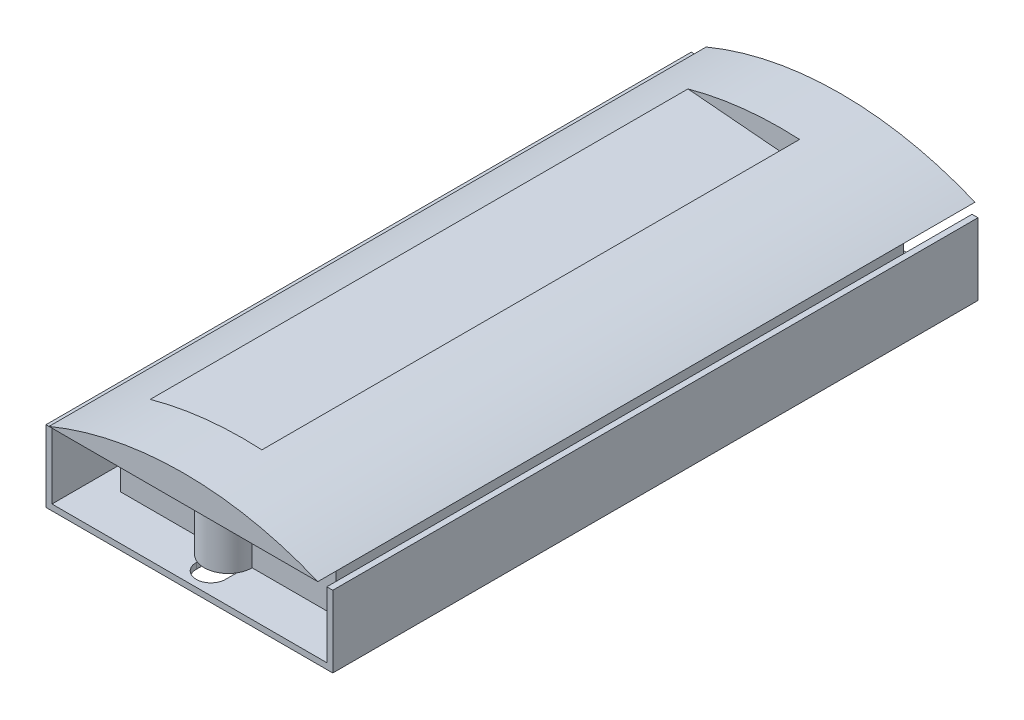
ISO-10303-21;
HEADER;
FILE_DESCRIPTION(('STEP AP214'),'2;1');
FILE_NAME('part.step','',(''),(''),'','','');
FILE_SCHEMA(('AUTOMOTIVE_DESIGN { 1 0 10303 214 1 1 1 1 }'));
ENDSEC;
DATA;
#1=APPLICATION_CONTEXT('core data for automotive mechanical design processes');
#2=APPLICATION_PROTOCOL_DEFINITION('international standard','automotive_design',2000,#1);
#3=PRODUCT_CONTEXT('',#1,'mechanical');
#4=PRODUCT('Part','Part','',(#3));
#5=PRODUCT_RELATED_PRODUCT_CATEGORY('part','',(#4));
#6=PRODUCT_DEFINITION_FORMATION('','',#4);
#7=PRODUCT_DEFINITION_CONTEXT('part definition',#1,'design');
#8=PRODUCT_DEFINITION('design','',#6,#7);
#9=PRODUCT_DEFINITION_SHAPE('','',#8);
#10=(LENGTH_UNIT() NAMED_UNIT(*) SI_UNIT(.MILLI.,.METRE.));
#11=(NAMED_UNIT(*) PLANE_ANGLE_UNIT() SI_UNIT($,.RADIAN.));
#12=(NAMED_UNIT(*) SI_UNIT($,.STERADIAN.) SOLID_ANGLE_UNIT());
#13=UNCERTAINTY_MEASURE_WITH_UNIT(LENGTH_MEASURE(1.E-05),#10,'distance_accuracy_value','');
#14=(GEOMETRIC_REPRESENTATION_CONTEXT(3) GLOBAL_UNCERTAINTY_ASSIGNED_CONTEXT((#13)) GLOBAL_UNIT_ASSIGNED_CONTEXT((#10,
#11,#12)) REPRESENTATION_CONTEXT('',''));
#15=CARTESIAN_POINT('',(0.,0.,0.));
#16=DIRECTION('',(0.,0.,1.));
#17=DIRECTION('',(1.,0.,0.));
#18=AXIS2_PLACEMENT_3D('',#15,#16,#17);
#19=CARTESIAN_POINT('',(0.,-13.,0.));
#20=DIRECTION('',(0.,1.,0.));
#21=DIRECTION('',(0.,0.,1.));
#22=AXIS2_PLACEMENT_3D('',#19,#20,#21);
#23=PLANE('',#22);
#24=CARTESIAN_POINT('',(22.5,-13.,4.6));
#25=DIRECTION('',(0.,-1.,0.));
#26=DIRECTION('',(0.,0.,-1.));
#27=AXIS2_PLACEMENT_3D('',#24,#25,#26);
#28=CIRCLE('',#27,2.45);
#29=CARTESIAN_POINT('',(20.05,-13.,4.6));
#30=VERTEX_POINT('',#29);
#31=CARTESIAN_POINT('',(24.95,-13.,4.60000000000001));
#32=VERTEX_POINT('',#31);
#33=EDGE_CURVE('E246',#30,#32,#28,.T.);
#34=ORIENTED_EDGE('',*,*,#33,.F.);
#35=DIRECTION('',(0.,0.,-1.));
#36=VECTOR('',#35,1.);
#37=CARTESIAN_POINT('',(20.05,-13.,4.6));
#38=LINE('',#37,#36);
#39=CARTESIAN_POINT('',(20.05,-13.,10.4));
#40=VERTEX_POINT('',#39);
#41=EDGE_CURVE('E254',#40,#30,#38,.T.);
#42=ORIENTED_EDGE('',*,*,#41,.F.);
#43=CARTESIAN_POINT('',(22.5,-13.,10.4));
#44=DIRECTION('',(0.,-1.,0.));
#45=DIRECTION('',(0.,0.,-1.));
#46=AXIS2_PLACEMENT_3D('',#43,#44,#45);
#47=CIRCLE('',#46,2.45);
#48=CARTESIAN_POINT('',(24.95,-13.,10.4));
#49=VERTEX_POINT('',#48);
#50=EDGE_CURVE('E251',#49,#40,#47,.T.);
#51=ORIENTED_EDGE('',*,*,#50,.F.);
#52=DIRECTION('',(0.,0.,1.));
#53=VECTOR('',#52,1.);
#54=CARTESIAN_POINT('',(24.95,-13.,4.60000000000001));
#55=LINE('',#54,#53);
#56=EDGE_CURVE('E248',#32,#49,#55,.T.);
#57=ORIENTED_EDGE('',*,*,#56,.F.);
#58=EDGE_LOOP('',(#34,#42,#51,#57));
#59=FACE_BOUND('',#58,.T.);
#60=DIRECTION('',(1.,0.,0.));
#61=VECTOR('',#60,1.);
#62=CARTESIAN_POINT('',(46.5,-13.,1.00000000000001));
#63=LINE('',#62,#61);
#64=CARTESIAN_POINT('',(-1.50000000000002,-13.,1.00000000000001));
#65=VERTEX_POINT('',#64);
#66=CARTESIAN_POINT('',(46.5,-13.,1.00000000000001));
#67=VERTEX_POINT('',#66);
#68=EDGE_CURVE('E280',#65,#67,#63,.T.);
#69=ORIENTED_EDGE('',*,*,#68,.T.);
#70=DIRECTION('',(0.,0.,1.));
#71=VECTOR('',#70,1.);
#72=CARTESIAN_POINT('',(46.5,-13.,109.));
#73=LINE('',#72,#71);
#74=CARTESIAN_POINT('',(46.5,-13.,109.));
#75=VERTEX_POINT('',#74);
#76=EDGE_CURVE('E283',#67,#75,#73,.T.);
#77=ORIENTED_EDGE('',*,*,#76,.T.);
#78=DIRECTION('',(-1.,0.,0.));
#79=VECTOR('',#78,1.);
#80=CARTESIAN_POINT('',(46.5,-13.,109.));
#81=LINE('',#80,#79);
#82=CARTESIAN_POINT('',(-1.50000000000002,-13.,109.));
#83=VERTEX_POINT('',#82);
#84=EDGE_CURVE('E173',#75,#83,#81,.T.);
#85=ORIENTED_EDGE('',*,*,#84,.T.);
#86=DIRECTION('',(0.,0.,-1.));
#87=VECTOR('',#86,1.);
#88=CARTESIAN_POINT('',(-1.50000000000002,-13.,109.));
#89=LINE('',#88,#87);
#90=EDGE_CURVE('E277',#83,#65,#89,.T.);
#91=ORIENTED_EDGE('',*,*,#90,.T.);
#92=EDGE_LOOP('',(#69,#77,#85,#91));
#93=FACE_BOUND('',#92,.T.);
#94=CARTESIAN_POINT('',(22.5,-13.,105.4));
#95=DIRECTION('',(0.,-1.,0.));
#96=DIRECTION('',(0.,0.,1.));
#97=AXIS2_PLACEMENT_3D('',#94,#95,#96);
#98=CIRCLE('',#97,2.45);
#99=CARTESIAN_POINT('',(24.95,-13.,105.4));
#100=VERTEX_POINT('',#99);
#101=CARTESIAN_POINT('',(20.05,-13.,105.4));
#102=VERTEX_POINT('',#101);
#103=EDGE_CURVE('E217',#100,#102,#98,.T.);
#104=ORIENTED_EDGE('',*,*,#103,.F.);
#105=DIRECTION('',(0.,0.,1.));
#106=VECTOR('',#105,1.);
#107=CARTESIAN_POINT('',(24.95,-13.,105.4));
#108=LINE('',#107,#106);
#109=CARTESIAN_POINT('',(24.95,-13.,99.6));
#110=VERTEX_POINT('',#109);
#111=EDGE_CURVE('E224',#110,#100,#108,.T.);
#112=ORIENTED_EDGE('',*,*,#111,.F.);
#113=CARTESIAN_POINT('',(22.5,-13.,99.6));
#114=DIRECTION('',(0.,-1.,0.));
#115=DIRECTION('',(0.,0.,1.));
#116=AXIS2_PLACEMENT_3D('',#113,#114,#115);
#117=CIRCLE('',#116,2.45);
#118=CARTESIAN_POINT('',(20.05,-13.,99.6));
#119=VERTEX_POINT('',#118);
#120=EDGE_CURVE('E222',#119,#110,#117,.T.);
#121=ORIENTED_EDGE('',*,*,#120,.F.);
#122=DIRECTION('',(0.,0.,-1.));
#123=VECTOR('',#122,1.);
#124=CARTESIAN_POINT('',(20.05,-13.,105.4));
#125=LINE('',#124,#123);
#126=EDGE_CURVE('E219',#102,#119,#125,.T.);
#127=ORIENTED_EDGE('',*,*,#126,.F.);
#128=EDGE_LOOP('',(#104,#112,#121,#127));
#129=FACE_BOUND('',#128,.T.);
#130=ADVANCED_FACE('F51',(#59,#93,#129),#23,.F.);
#131=CARTESIAN_POINT('',(0.,-12.,0.));
#132=DIRECTION('',(0.,1.,0.));
#133=DIRECTION('',(0.,0.,1.));
#134=AXIS2_PLACEMENT_3D('',#131,#132,#133);
#135=PLANE('',#134);
#136=DIRECTION('',(0.,0.,1.));
#137=VECTOR('',#136,1.);
#138=CARTESIAN_POINT('',(45.5,-12.,0.));
#139=LINE('',#138,#137);
#140=CARTESIAN_POINT('',(45.5,-12.,1.00000000000001));
#141=VERTEX_POINT('',#140);
#142=CARTESIAN_POINT('',(45.5,-12.,109.));
#143=VERTEX_POINT('',#142);
#144=EDGE_CURVE('E198',#141,#143,#139,.T.);
#145=ORIENTED_EDGE('',*,*,#144,.F.);
#146=DIRECTION('',(1.,0.,0.));
#147=VECTOR('',#146,1.);
#148=CARTESIAN_POINT('',(46.5,-12.,1.00000000000001));
#149=LINE('',#148,#147);
#150=CARTESIAN_POINT('',(-0.500000000000014,-12.,1.00000000000001));
#151=VERTEX_POINT('',#150);
#152=EDGE_CURVE('E276',#151,#141,#149,.T.);
#153=ORIENTED_EDGE('',*,*,#152,.F.);
#154=DIRECTION('',(0.,0.,-1.));
#155=VECTOR('',#154,1.);
#156=CARTESIAN_POINT('',(-0.500000000000015,-12.,0.));
#157=LINE('',#156,#155);
#158=CARTESIAN_POINT('',(-0.500000000000015,-12.,109.));
#159=VERTEX_POINT('',#158);
#160=EDGE_CURVE('E205',#159,#151,#157,.T.);
#161=ORIENTED_EDGE('',*,*,#160,.F.);
#162=DIRECTION('',(-1.,0.,0.));
#163=VECTOR('',#162,1.);
#164=CARTESIAN_POINT('',(46.5,-12.,109.));
#165=LINE('',#164,#163);
#166=EDGE_CURVE('E281',#143,#159,#165,.T.);
#167=ORIENTED_EDGE('',*,*,#166,.F.);
#168=EDGE_LOOP('',(#145,#153,#161,#167));
#169=FACE_BOUND('',#168,.T.);
#170=DIRECTION('',(0.,0.,-1.));
#171=VECTOR('',#170,1.);
#172=CARTESIAN_POINT('',(20.05,-12.,4.6));
#173=LINE('',#172,#171);
#174=CARTESIAN_POINT('',(20.05,-12.,10.4));
#175=VERTEX_POINT('',#174);
#176=CARTESIAN_POINT('',(20.05,-12.,4.6));
#177=VERTEX_POINT('',#176);
#178=EDGE_CURVE('E249',#175,#177,#173,.T.);
#179=ORIENTED_EDGE('',*,*,#178,.T.);
#180=CARTESIAN_POINT('',(22.5,-12.,4.6));
#181=DIRECTION('',(0.,-1.,0.));
#182=DIRECTION('',(0.,0.,-1.));
#183=AXIS2_PLACEMENT_3D('',#180,#181,#182);
#184=CIRCLE('',#183,2.45);
#185=CARTESIAN_POINT('',(24.95,-12.,4.60000000000001));
#186=VERTEX_POINT('',#185);
#187=EDGE_CURVE('E245',#177,#186,#184,.T.);
#188=ORIENTED_EDGE('',*,*,#187,.T.);
#189=DIRECTION('',(0.,0.,1.));
#190=VECTOR('',#189,1.);
#191=CARTESIAN_POINT('',(24.95,-12.,4.60000000000001));
#192=LINE('',#191,#190);
#193=CARTESIAN_POINT('',(24.95,-12.,10.4));
#194=VERTEX_POINT('',#193);
#195=EDGE_CURVE('E259',#186,#194,#192,.T.);
#196=ORIENTED_EDGE('',*,*,#195,.T.);
#197=CARTESIAN_POINT('',(22.5,-12.,10.4));
#198=DIRECTION('',(0.,-1.,0.));
#199=DIRECTION('',(0.,0.,-1.));
#200=AXIS2_PLACEMENT_3D('',#197,#198,#199);
#201=CIRCLE('',#200,2.45);
#202=EDGE_CURVE('E262',#194,#175,#201,.T.);
#203=ORIENTED_EDGE('',*,*,#202,.T.);
#204=EDGE_LOOP('',(#179,#188,#196,#203));
#205=FACE_BOUND('',#204,.T.);
#206=DIRECTION('',(0.,0.,1.));
#207=VECTOR('',#206,1.);
#208=CARTESIAN_POINT('',(24.95,-12.,105.4));
#209=LINE('',#208,#207);
#210=CARTESIAN_POINT('',(24.95,-12.,99.6));
#211=VERTEX_POINT('',#210);
#212=CARTESIAN_POINT('',(24.95,-12.,105.4));
#213=VERTEX_POINT('',#212);
#214=EDGE_CURVE('E220',#211,#213,#209,.T.);
#215=ORIENTED_EDGE('',*,*,#214,.T.);
#216=CARTESIAN_POINT('',(22.5,-12.,105.4));
#217=DIRECTION('',(0.,-1.,0.));
#218=DIRECTION('',(0.,0.,1.));
#219=AXIS2_PLACEMENT_3D('',#216,#217,#218);
#220=CIRCLE('',#219,2.45);
#221=CARTESIAN_POINT('',(20.05,-12.,105.4));
#222=VERTEX_POINT('',#221);
#223=EDGE_CURVE('E216',#213,#222,#220,.T.);
#224=ORIENTED_EDGE('',*,*,#223,.T.);
#225=DIRECTION('',(0.,0.,-1.));
#226=VECTOR('',#225,1.);
#227=CARTESIAN_POINT('',(20.05,-12.,105.4));
#228=LINE('',#227,#226);
#229=CARTESIAN_POINT('',(20.05,-12.,99.6));
#230=VERTEX_POINT('',#229);
#231=EDGE_CURVE('E229',#222,#230,#228,.T.);
#232=ORIENTED_EDGE('',*,*,#231,.T.);
#233=CARTESIAN_POINT('',(22.5,-12.,99.6));
#234=DIRECTION('',(0.,-1.,0.));
#235=DIRECTION('',(0.,0.,1.));
#236=AXIS2_PLACEMENT_3D('',#233,#234,#235);
#237=CIRCLE('',#236,2.45);
#238=EDGE_CURVE('E232',#230,#211,#237,.T.);
#239=ORIENTED_EDGE('',*,*,#238,.T.);
#240=EDGE_LOOP('',(#215,#224,#232,#239));
#241=FACE_BOUND('',#240,.T.);
#242=ADVANCED_FACE('F305',(#169,#205,#241),#135,.T.);
#243=CARTESIAN_POINT('',(-1.50000000000002,-13.,109.));
#244=DIRECTION('',(1.,0.,0.));
#245=DIRECTION('',(0.,0.,-1.));
#246=AXIS2_PLACEMENT_3D('',#243,#244,#245);
#247=PLANE('',#246);
#248=DIRECTION('',(0.,1.,0.));
#249=VECTOR('',#248,1.);
#250=CARTESIAN_POINT('',(-1.50000000000002,-13.,109.));
#251=LINE('',#250,#249);
#252=CARTESIAN_POINT('',(-1.50000000000002,-1.,109.));
#253=VERTEX_POINT('',#252);
#254=EDGE_CURVE('E176',#83,#253,#251,.T.);
#255=ORIENTED_EDGE('',*,*,#254,.T.);
#256=DIRECTION('',(0.,0.,1.));
#257=VECTOR('',#256,1.);
#258=CARTESIAN_POINT('',(-1.50000000000002,-1.,-11.0415945787923));
#259=LINE('',#258,#257);
#260=CARTESIAN_POINT('',(-1.50000000000002,-1.,1.00000000000001));
#261=VERTEX_POINT('',#260);
#262=EDGE_CURVE('E203',#261,#253,#259,.T.);
#263=ORIENTED_EDGE('',*,*,#262,.F.);
#264=DIRECTION('',(0.,1.,0.));
#265=VECTOR('',#264,1.);
#266=CARTESIAN_POINT('',(-1.50000000000002,-13.,1.00000000000001));
#267=LINE('',#266,#265);
#268=EDGE_CURVE('E12',#65,#261,#267,.T.);
#269=ORIENTED_EDGE('',*,*,#268,.F.);
#270=ORIENTED_EDGE('',*,*,#90,.F.);
#271=EDGE_LOOP('',(#255,#263,#269,#270));
#272=FACE_BOUND('',#271,.T.);
#273=ADVANCED_FACE('F53',(#272),#247,.F.);
#274=CARTESIAN_POINT('',(46.5,-13.,1.00000000000001));
#275=DIRECTION('',(0.,0.,1.));
#276=DIRECTION('',(1.,0.,0.));
#277=AXIS2_PLACEMENT_3D('',#274,#275,#276);
#278=PLANE('',#277);
#279=ORIENTED_EDGE('',*,*,#152,.T.);
#280=DIRECTION('',(0.,1.,0.));
#281=VECTOR('',#280,1.);
#282=CARTESIAN_POINT('',(45.5,-13.,1.00000000000001));
#283=LINE('',#282,#281);
#284=CARTESIAN_POINT('',(45.5,-0.999999999999995,1.00000000000001));
#285=VERTEX_POINT('',#284);
#286=EDGE_CURVE('E193',#141,#285,#283,.T.);
#287=ORIENTED_EDGE('',*,*,#286,.T.);
#288=DIRECTION('',(1.,0.,0.));
#289=VECTOR('',#288,1.);
#290=CARTESIAN_POINT('',(46.5,-0.999999999999995,1.00000000000001));
#291=LINE('',#290,#289);
#292=CARTESIAN_POINT('',(46.5,-0.999999999999995,1.00000000000001));
#293=VERTEX_POINT('',#292);
#294=EDGE_CURVE('E196',#285,#293,#291,.T.);
#295=ORIENTED_EDGE('',*,*,#294,.T.);
#296=DIRECTION('',(0.,1.,0.));
#297=VECTOR('',#296,1.);
#298=CARTESIAN_POINT('',(46.5,-13.,1.00000000000001));
#299=LINE('',#298,#297);
#300=EDGE_CURVE('E59',#67,#293,#299,.T.);
#301=ORIENTED_EDGE('',*,*,#300,.F.);
#302=ORIENTED_EDGE('',*,*,#68,.F.);
#303=ORIENTED_EDGE('',*,*,#268,.T.);
#304=DIRECTION('',(1.,0.,0.));
#305=VECTOR('',#304,1.);
#306=CARTESIAN_POINT('',(-1.50000000000002,-1.,1.00000000000001));
#307=LINE('',#306,#305);
#308=CARTESIAN_POINT('',(-0.500000000000015,-1.,1.00000000000001));
#309=VERTEX_POINT('',#308);
#310=EDGE_CURVE('E202',#261,#309,#307,.T.);
#311=ORIENTED_EDGE('',*,*,#310,.T.);
#312=DIRECTION('',(0.,-1.,0.));
#313=VECTOR('',#312,1.);
#314=CARTESIAN_POINT('',(-0.500000000000015,-13.,1.00000000000001));
#315=LINE('',#314,#313);
#316=EDGE_CURVE('E66',#309,#151,#315,.T.);
#317=ORIENTED_EDGE('',*,*,#316,.T.);
#318=EDGE_LOOP('',(#279,#287,#295,#301,#302,#303,#311,#317));
#319=FACE_BOUND('',#318,.T.);
#320=ADVANCED_FACE('F307',(#319),#278,.F.);
#321=CARTESIAN_POINT('',(46.5,-13.,109.));
#322=DIRECTION('',(-1.,0.,0.));
#323=DIRECTION('',(0.,0.,1.));
#324=AXIS2_PLACEMENT_3D('',#321,#322,#323);
#325=PLANE('',#324);
#326=ORIENTED_EDGE('',*,*,#300,.T.);
#327=DIRECTION('',(0.,0.,1.));
#328=VECTOR('',#327,1.);
#329=CARTESIAN_POINT('',(46.5,-0.999999999999995,-11.0415945787923));
#330=LINE('',#329,#328);
#331=CARTESIAN_POINT('',(46.5,-0.999999999999995,109.));
#332=VERTEX_POINT('',#331);
#333=EDGE_CURVE('E179',#293,#332,#330,.T.);
#334=ORIENTED_EDGE('',*,*,#333,.T.);
#335=DIRECTION('',(0.,1.,0.));
#336=VECTOR('',#335,1.);
#337=CARTESIAN_POINT('',(46.5,-13.,109.));
#338=LINE('',#337,#336);
#339=EDGE_CURVE('E165',#75,#332,#338,.T.);
#340=ORIENTED_EDGE('',*,*,#339,.F.);
#341=ORIENTED_EDGE('',*,*,#76,.F.);
#342=EDGE_LOOP('',(#326,#334,#340,#341));
#343=FACE_BOUND('',#342,.T.);
#344=ADVANCED_FACE('F180',(#343),#325,.F.);
#345=CARTESIAN_POINT('',(46.5,-13.,109.));
#346=DIRECTION('',(0.,0.,-1.));
#347=DIRECTION('',(-1.,0.,0.));
#348=AXIS2_PLACEMENT_3D('',#345,#346,#347);
#349=PLANE('',#348);
#350=ORIENTED_EDGE('',*,*,#254,.F.);
#351=ORIENTED_EDGE('',*,*,#84,.F.);
#352=ORIENTED_EDGE('',*,*,#339,.T.);
#353=DIRECTION('',(-1.,0.,0.));
#354=VECTOR('',#353,1.);
#355=CARTESIAN_POINT('',(46.5,-0.999999999999995,109.));
#356=LINE('',#355,#354);
#357=CARTESIAN_POINT('',(45.5,-0.999999999999995,109.));
#358=VERTEX_POINT('',#357);
#359=EDGE_CURVE('E171',#332,#358,#356,.T.);
#360=ORIENTED_EDGE('',*,*,#359,.T.);
#361=DIRECTION('',(0.,-1.,0.));
#362=VECTOR('',#361,1.);
#363=CARTESIAN_POINT('',(45.5,-13.,109.));
#364=LINE('',#363,#362);
#365=EDGE_CURVE('E186',#358,#143,#364,.T.);
#366=ORIENTED_EDGE('',*,*,#365,.T.);
#367=ORIENTED_EDGE('',*,*,#166,.T.);
#368=DIRECTION('',(0.,1.,0.));
#369=VECTOR('',#368,1.);
#370=CARTESIAN_POINT('',(-0.500000000000015,-13.,109.));
#371=LINE('',#370,#369);
#372=CARTESIAN_POINT('',(-0.500000000000015,-1.,109.));
#373=VERTEX_POINT('',#372);
#374=EDGE_CURVE('E200',#159,#373,#371,.T.);
#375=ORIENTED_EDGE('',*,*,#374,.T.);
#376=DIRECTION('',(-1.,0.,0.));
#377=VECTOR('',#376,1.);
#378=CARTESIAN_POINT('',(-1.50000000000002,-1.,109.));
#379=LINE('',#378,#377);
#380=EDGE_CURVE('E207',#373,#253,#379,.T.);
#381=ORIENTED_EDGE('',*,*,#380,.T.);
#382=EDGE_LOOP('',(#350,#351,#352,#360,#366,#367,#375,#381));
#383=FACE_BOUND('',#382,.T.);
#384=ADVANCED_FACE('F168',(#383),#349,.F.);
#385=CARTESIAN_POINT('',(22.5,-13.,4.6));
#386=DIRECTION('',(0.,1.,0.));
#387=DIRECTION('',(0.,0.,1.));
#388=AXIS2_PLACEMENT_3D('',#385,#386,#387);
#389=CYLINDRICAL_SURFACE('',#388,2.45);
#390=ORIENTED_EDGE('',*,*,#187,.F.);
#391=DIRECTION('',(0.,1.,0.));
#392=VECTOR('',#391,1.);
#393=CARTESIAN_POINT('',(20.05,-13.,4.6));
#394=LINE('',#393,#392);
#395=EDGE_CURVE('E256',#30,#177,#394,.T.);
#396=ORIENTED_EDGE('',*,*,#395,.F.);
#397=ORIENTED_EDGE('',*,*,#33,.T.);
#398=DIRECTION('',(0.,1.,0.));
#399=VECTOR('',#398,1.);
#400=CARTESIAN_POINT('',(24.95,-13.,4.60000000000001));
#401=LINE('',#400,#399);
#402=EDGE_CURVE('E273',#32,#186,#401,.T.);
#403=ORIENTED_EDGE('',*,*,#402,.T.);
#404=EDGE_LOOP('',(#390,#396,#397,#403));
#405=FACE_BOUND('',#404,.T.);
#406=ADVANCED_FACE('F328',(#405),#389,.F.);
#407=CARTESIAN_POINT('',(24.95,-13.,4.60000000000001));
#408=DIRECTION('',(-1.,0.,0.));
#409=DIRECTION('',(0.,0.,1.));
#410=AXIS2_PLACEMENT_3D('',#407,#408,#409);
#411=PLANE('',#410);
#412=ORIENTED_EDGE('',*,*,#195,.F.);
#413=ORIENTED_EDGE('',*,*,#402,.F.);
#414=ORIENTED_EDGE('',*,*,#56,.T.);
#415=DIRECTION('',(0.,1.,0.));
#416=VECTOR('',#415,1.);
#417=CARTESIAN_POINT('',(24.95,-13.,10.4));
#418=LINE('',#417,#416);
#419=EDGE_CURVE('E271',#49,#194,#418,.T.);
#420=ORIENTED_EDGE('',*,*,#419,.T.);
#421=EDGE_LOOP('',(#412,#413,#414,#420));
#422=FACE_BOUND('',#421,.T.);
#423=ADVANCED_FACE('F409',(#422),#411,.T.);
#424=CARTESIAN_POINT('',(22.5,-13.,10.4));
#425=DIRECTION('',(0.,1.,0.));
#426=DIRECTION('',(0.,0.,1.));
#427=AXIS2_PLACEMENT_3D('',#424,#425,#426);
#428=CYLINDRICAL_SURFACE('',#427,2.45);
#429=ORIENTED_EDGE('',*,*,#202,.F.);
#430=ORIENTED_EDGE('',*,*,#419,.F.);
#431=ORIENTED_EDGE('',*,*,#50,.T.);
#432=DIRECTION('',(0.,1.,0.));
#433=VECTOR('',#432,1.);
#434=CARTESIAN_POINT('',(20.05,-13.,10.4));
#435=LINE('',#434,#433);
#436=EDGE_CURVE('E269',#40,#175,#435,.T.);
#437=ORIENTED_EDGE('',*,*,#436,.T.);
#438=EDGE_LOOP('',(#429,#430,#431,#437));
#439=FACE_BOUND('',#438,.T.);
#440=ADVANCED_FACE('F399',(#439),#428,.F.);
#441=CARTESIAN_POINT('',(20.05,-13.,4.6));
#442=DIRECTION('',(1.,0.,0.));
#443=DIRECTION('',(0.,0.,-1.));
#444=AXIS2_PLACEMENT_3D('',#441,#442,#443);
#445=PLANE('',#444);
#446=ORIENTED_EDGE('',*,*,#178,.F.);
#447=ORIENTED_EDGE('',*,*,#436,.F.);
#448=ORIENTED_EDGE('',*,*,#41,.T.);
#449=ORIENTED_EDGE('',*,*,#395,.T.);
#450=EDGE_LOOP('',(#446,#447,#448,#449));
#451=FACE_BOUND('',#450,.T.);
#452=ADVANCED_FACE('F389',(#451),#445,.T.);
#453=CARTESIAN_POINT('',(22.5,-13.,105.4));
#454=DIRECTION('',(0.,1.,0.));
#455=DIRECTION('',(0.,0.,1.));
#456=AXIS2_PLACEMENT_3D('',#453,#454,#455);
#457=CYLINDRICAL_SURFACE('',#456,2.45);
#458=ORIENTED_EDGE('',*,*,#223,.F.);
#459=DIRECTION('',(0.,1.,0.));
#460=VECTOR('',#459,1.);
#461=CARTESIAN_POINT('',(24.95,-13.,105.4));
#462=LINE('',#461,#460);
#463=EDGE_CURVE('E226',#100,#213,#462,.T.);
#464=ORIENTED_EDGE('',*,*,#463,.F.);
#465=ORIENTED_EDGE('',*,*,#103,.T.);
#466=DIRECTION('',(0.,1.,0.));
#467=VECTOR('',#466,1.);
#468=CARTESIAN_POINT('',(20.05,-13.,105.4));
#469=LINE('',#468,#467);
#470=EDGE_CURVE('E242',#102,#222,#469,.T.);
#471=ORIENTED_EDGE('',*,*,#470,.T.);
#472=EDGE_LOOP('',(#458,#464,#465,#471));
#473=FACE_BOUND('',#472,.T.);
#474=ADVANCED_FACE('F379',(#473),#457,.F.);
#475=CARTESIAN_POINT('',(20.05,-13.,105.4));
#476=DIRECTION('',(1.,0.,0.));
#477=DIRECTION('',(0.,0.,-1.));
#478=AXIS2_PLACEMENT_3D('',#475,#476,#477);
#479=PLANE('',#478);
#480=ORIENTED_EDGE('',*,*,#231,.F.);
#481=ORIENTED_EDGE('',*,*,#470,.F.);
#482=ORIENTED_EDGE('',*,*,#126,.T.);
#483=DIRECTION('',(0.,1.,0.));
#484=VECTOR('',#483,1.);
#485=CARTESIAN_POINT('',(20.05,-13.,99.6));
#486=LINE('',#485,#484);
#487=EDGE_CURVE('E240',#119,#230,#486,.T.);
#488=ORIENTED_EDGE('',*,*,#487,.T.);
#489=EDGE_LOOP('',(#480,#481,#482,#488));
#490=FACE_BOUND('',#489,.T.);
#491=ADVANCED_FACE('F369',(#490),#479,.T.);
#492=CARTESIAN_POINT('',(22.5,-13.,99.6));
#493=DIRECTION('',(0.,1.,0.));
#494=DIRECTION('',(0.,0.,1.));
#495=AXIS2_PLACEMENT_3D('',#492,#493,#494);
#496=CYLINDRICAL_SURFACE('',#495,2.45);
#497=ORIENTED_EDGE('',*,*,#238,.F.);
#498=ORIENTED_EDGE('',*,*,#487,.F.);
#499=ORIENTED_EDGE('',*,*,#120,.T.);
#500=DIRECTION('',(0.,1.,0.));
#501=VECTOR('',#500,1.);
#502=CARTESIAN_POINT('',(24.95,-13.,99.6));
#503=LINE('',#502,#501);
#504=EDGE_CURVE('E74',#110,#211,#503,.T.);
#505=ORIENTED_EDGE('',*,*,#504,.T.);
#506=EDGE_LOOP('',(#497,#498,#499,#505));
#507=FACE_BOUND('',#506,.T.);
#508=ADVANCED_FACE('F359',(#507),#496,.F.);
#509=CARTESIAN_POINT('',(24.95,-13.,105.4));
#510=DIRECTION('',(-1.,0.,0.));
#511=DIRECTION('',(0.,0.,1.));
#512=AXIS2_PLACEMENT_3D('',#509,#510,#511);
#513=PLANE('',#512);
#514=ORIENTED_EDGE('',*,*,#214,.F.);
#515=ORIENTED_EDGE('',*,*,#504,.F.);
#516=ORIENTED_EDGE('',*,*,#111,.T.);
#517=ORIENTED_EDGE('',*,*,#463,.T.);
#518=EDGE_LOOP('',(#514,#515,#516,#517));
#519=FACE_BOUND('',#518,.T.);
#520=ADVANCED_FACE('F354',(#519),#513,.T.);
#521=CARTESIAN_POINT('',(-1.50000000000002,-1.,-11.0415945787923));
#522=DIRECTION('',(0.,1.,0.));
#523=DIRECTION('',(0.,0.,1.));
#524=AXIS2_PLACEMENT_3D('',#521,#522,#523);
#525=PLANE('',#524);
#526=ORIENTED_EDGE('',*,*,#310,.F.);
#527=ORIENTED_EDGE('',*,*,#262,.T.);
#528=ORIENTED_EDGE('',*,*,#380,.F.);
#529=DIRECTION('',(0.,0.,1.));
#530=VECTOR('',#529,1.);
#531=CARTESIAN_POINT('',(-0.500000000000015,-1.,-11.0415945787923));
#532=LINE('',#531,#530);
#533=EDGE_CURVE('E210',#309,#373,#532,.T.);
#534=ORIENTED_EDGE('',*,*,#533,.F.);
#535=EDGE_LOOP('',(#526,#527,#528,#534));
#536=FACE_BOUND('',#535,.T.);
#537=ADVANCED_FACE('F295',(#536),#525,.T.);
#538=CARTESIAN_POINT('',(-0.500000000000015,-13.,-11.0415945787923));
#539=DIRECTION('',(1.,0.,0.));
#540=DIRECTION('',(0.,0.,-1.));
#541=AXIS2_PLACEMENT_3D('',#538,#539,#540);
#542=PLANE('',#541);
#543=ORIENTED_EDGE('',*,*,#374,.F.);
#544=ORIENTED_EDGE('',*,*,#160,.T.);
#545=ORIENTED_EDGE('',*,*,#316,.F.);
#546=ORIENTED_EDGE('',*,*,#533,.T.);
#547=EDGE_LOOP('',(#543,#544,#545,#546));
#548=FACE_BOUND('',#547,.T.);
#549=ADVANCED_FACE('F301',(#548),#542,.T.);
#550=CARTESIAN_POINT('',(45.5,-13.,-11.0415945787923));
#551=DIRECTION('',(-1.,0.,0.));
#552=DIRECTION('',(0.,0.,1.));
#553=AXIS2_PLACEMENT_3D('',#550,#551,#552);
#554=PLANE('',#553);
#555=ORIENTED_EDGE('',*,*,#286,.F.);
#556=ORIENTED_EDGE('',*,*,#144,.T.);
#557=ORIENTED_EDGE('',*,*,#365,.F.);
#558=DIRECTION('',(0.,0.,1.));
#559=VECTOR('',#558,1.);
#560=CARTESIAN_POINT('',(45.5,-0.999999999999995,-11.0415945787923));
#561=LINE('',#560,#559);
#562=EDGE_CURVE('E185',#285,#358,#561,.T.);
#563=ORIENTED_EDGE('',*,*,#562,.F.);
#564=EDGE_LOOP('',(#555,#556,#557,#563));
#565=FACE_BOUND('',#564,.T.);
#566=ADVANCED_FACE('F309',(#565),#554,.T.);
#567=CARTESIAN_POINT('',(46.5,-0.999999999999995,-11.0415945787923));
#568=DIRECTION('',(0.,1.,0.));
#569=DIRECTION('',(-1.,0.,0.));
#570=AXIS2_PLACEMENT_3D('',#567,#568,#569);
#571=PLANE('',#570);
#572=ORIENTED_EDGE('',*,*,#294,.F.);
#573=ORIENTED_EDGE('',*,*,#562,.T.);
#574=ORIENTED_EDGE('',*,*,#359,.F.);
#575=ORIENTED_EDGE('',*,*,#333,.F.);
#576=EDGE_LOOP('',(#572,#573,#574,#575));
#577=FACE_BOUND('',#576,.T.);
#578=ADVANCED_FACE('F188',(#577),#571,.T.);
#579=CLOSED_SHELL('',(#130,#242,#273,#320,#344,#384,#406,#423,#440,#452,#474,#491,#508,#520,
#537,#549,#566,#578));
#580=MANIFOLD_SOLID_BREP('B2',#579);
#581=CARTESIAN_POINT('',(22.5,-54.,110.));
#582=DIRECTION('',(0.,0.,-1.));
#583=DIRECTION('',(-1.,0.,0.));
#584=AXIS2_PLACEMENT_3D('',#581,#582,#583);
#585=CYLINDRICAL_SURFACE('',#584,58.5);
#586=CARTESIAN_POINT('',(22.5,-54.,0.));
#587=DIRECTION('',(0.,0.,1.));
#588=DIRECTION('',(-1.,0.,0.));
#589=AXIS2_PLACEMENT_3D('',#586,#587,#588);
#590=CIRCLE('',#589,58.5);
#591=CARTESIAN_POINT('',(45.,0.,0.));
#592=VERTEX_POINT('',#591);
#593=CARTESIAN_POINT('',(0.,0.,0.));
#594=VERTEX_POINT('',#593);
#595=EDGE_CURVE('E735',#592,#594,#590,.T.);
#596=ORIENTED_EDGE('',*,*,#595,.T.);
#597=DIRECTION('',(0.,0.,-1.));
#598=VECTOR('',#597,1.);
#599=CARTESIAN_POINT('',(0.,0.,110.));
#600=LINE('',#599,#598);
#601=CARTESIAN_POINT('',(0.,0.,110.));
#602=VERTEX_POINT('',#601);
#603=EDGE_CURVE('E617',#602,#594,#600,.T.);
#604=ORIENTED_EDGE('',*,*,#603,.F.);
#605=CARTESIAN_POINT('',(22.5,-54.,110.));
#606=DIRECTION('',(0.,0.,1.));
#607=DIRECTION('',(-1.,0.,0.));
#608=AXIS2_PLACEMENT_3D('',#605,#606,#607);
#609=CIRCLE('',#608,58.5);
#610=CARTESIAN_POINT('',(45.,0.,110.));
#611=VERTEX_POINT('',#610);
#612=EDGE_CURVE('E736',#611,#602,#609,.T.);
#613=ORIENTED_EDGE('',*,*,#612,.F.);
#614=DIRECTION('',(0.,0.,-1.));
#615=VECTOR('',#614,1.);
#616=CARTESIAN_POINT('',(45.,0.,110.));
#617=LINE('',#616,#615);
#618=EDGE_CURVE('E744',#611,#592,#617,.T.);
#619=ORIENTED_EDGE('',*,*,#618,.T.);
#620=EDGE_LOOP('',(#596,#604,#613,#619));
#621=FACE_BOUND('',#620,.T.);
#622=CARTESIAN_POINT('',(22.5,-54.,9.99999999999999));
#623=DIRECTION('',(0.,0.,1.));
#624=DIRECTION('',(1.,0.,0.));
#625=AXIS2_PLACEMENT_3D('',#622,#623,#624);
#626=CIRCLE('',#625,58.5);
#627=CARTESIAN_POINT('',(25.6355375998647,4.415908825934,10.));
#628=VERTEX_POINT('',#627);
#629=CARTESIAN_POINT('',(6.95185149151565,2.39596685897064,9.99999999999999));
#630=VERTEX_POINT('',#629);
#631=EDGE_CURVE('E49',#628,#630,#626,.T.);
#632=ORIENTED_EDGE('',*,*,#631,.F.);
#633=DIRECTION('',(0.,0.,1.));
#634=VECTOR('',#633,1.);
#635=CARTESIAN_POINT('',(25.6355375998647,4.415908825934,10.));
#636=LINE('',#635,#634);
#637=CARTESIAN_POINT('',(25.6355375998647,4.415908825934,100.));
#638=VERTEX_POINT('',#637);
#639=EDGE_CURVE('E622',#628,#638,#636,.T.);
#640=ORIENTED_EDGE('',*,*,#639,.T.);
#641=CARTESIAN_POINT('',(22.5,-54.,100.));
#642=DIRECTION('',(0.,0.,1.));
#643=DIRECTION('',(1.,0.,0.));
#644=AXIS2_PLACEMENT_3D('',#641,#642,#643);
#645=CIRCLE('',#644,58.5);
#646=CARTESIAN_POINT('',(6.95185149151565,2.39596685897064,100.));
#647=VERTEX_POINT('',#646);
#648=EDGE_CURVE('E609',#638,#647,#645,.T.);
#649=ORIENTED_EDGE('',*,*,#648,.T.);
#650=DIRECTION('',(0.,0.,-1.));
#651=VECTOR('',#650,1.);
#652=CARTESIAN_POINT('',(6.95185149151565,2.39596685897064,110.));
#653=LINE('',#652,#651);
#654=EDGE_CURVE('E517',#630,#647,#653,.F.);
#655=ORIENTED_EDGE('',*,*,#654,.F.);
#656=EDGE_LOOP('',(#632,#640,#649,#655));
#657=FACE_BOUND('',#656,.T.);
#658=ADVANCED_FACE('F509',(#621,#657),#585,.T.);
#659=CARTESIAN_POINT('',(0.,0.,110.));
#660=DIRECTION('',(0.,1.,0.));
#661=DIRECTION('',(0.,0.,1.));
#662=AXIS2_PLACEMENT_3D('',#659,#660,#661);
#663=PLANE('',#662);
#664=DIRECTION('',(1.,0.,0.));
#665=VECTOR('',#664,1.);
#666=CARTESIAN_POINT('',(0.,0.,0.));
#667=LINE('',#666,#665);
#668=EDGE_CURVE('E741',#594,#592,#667,.T.);
#669=ORIENTED_EDGE('',*,*,#668,.T.);
#670=ORIENTED_EDGE('',*,*,#618,.F.);
#671=DIRECTION('',(1.,0.,0.));
#672=VECTOR('',#671,1.);
#673=CARTESIAN_POINT('',(0.,0.,110.));
#674=LINE('',#673,#672);
#675=EDGE_CURVE('E740',#602,#611,#674,.T.);
#676=ORIENTED_EDGE('',*,*,#675,.F.);
#677=ORIENTED_EDGE('',*,*,#603,.T.);
#678=EDGE_LOOP('',(#669,#670,#676,#677));
#679=FACE_BOUND('',#678,.T.);
#680=DIRECTION('',(1.,0.,0.));
#681=VECTOR('',#680,1.);
#682=CARTESIAN_POINT('',(0.,0.,7.50000000000001));
#683=LINE('',#682,#681);
#684=CARTESIAN_POINT('',(4.49999999999999,0.,7.50000000000001));
#685=VERTEX_POINT('',#684);
#686=CARTESIAN_POINT('',(18.5,0.,7.5));
#687=VERTEX_POINT('',#686);
#688=EDGE_CURVE('E646',#685,#687,#683,.T.);
#689=ORIENTED_EDGE('',*,*,#688,.F.);
#690=DIRECTION('',(0.,0.,1.));
#691=VECTOR('',#690,1.);
#692=CARTESIAN_POINT('',(4.49999999999999,0.,0.));
#693=LINE('',#692,#691);
#694=CARTESIAN_POINT('',(4.49999999999998,0.,102.5));
#695=VERTEX_POINT('',#694);
#696=EDGE_CURVE('E659',#685,#695,#693,.T.);
#697=ORIENTED_EDGE('',*,*,#696,.T.);
#698=DIRECTION('',(1.,0.,0.));
#699=VECTOR('',#698,1.);
#700=CARTESIAN_POINT('',(0.,0.,102.5));
#701=LINE('',#700,#699);
#702=CARTESIAN_POINT('',(18.5,0.,102.5));
#703=VERTEX_POINT('',#702);
#704=EDGE_CURVE('E532',#695,#703,#701,.T.);
#705=ORIENTED_EDGE('',*,*,#704,.T.);
#706=CARTESIAN_POINT('',(22.5,0.,102.5));
#707=DIRECTION('',(0.,-1.,0.));
#708=DIRECTION('',(0.,0.,-1.));
#709=AXIS2_PLACEMENT_3D('',#706,#707,#708);
#710=CIRCLE('',#709,4.);
#711=CARTESIAN_POINT('',(26.5,0.,102.5));
#712=VERTEX_POINT('',#711);
#713=EDGE_CURVE('E701',#712,#703,#710,.T.);
#714=ORIENTED_EDGE('',*,*,#713,.F.);
#715=DIRECTION('',(1.,0.,0.));
#716=VECTOR('',#715,1.);
#717=CARTESIAN_POINT('',(0.,0.,102.5));
#718=LINE('',#717,#716);
#719=CARTESIAN_POINT('',(40.5,0.,102.5));
#720=VERTEX_POINT('',#719);
#721=EDGE_CURVE('E697',#712,#720,#718,.T.);
#722=ORIENTED_EDGE('',*,*,#721,.T.);
#723=DIRECTION('',(0.,0.,1.));
#724=VECTOR('',#723,1.);
#725=CARTESIAN_POINT('',(40.5,0.,0.));
#726=LINE('',#725,#724);
#727=CARTESIAN_POINT('',(40.5,0.,7.5));
#728=VERTEX_POINT('',#727);
#729=EDGE_CURVE('E693',#728,#720,#726,.T.);
#730=ORIENTED_EDGE('',*,*,#729,.F.);
#731=DIRECTION('',(1.,0.,0.));
#732=VECTOR('',#731,1.);
#733=CARTESIAN_POINT('',(0.,0.,7.50000000000001));
#734=LINE('',#733,#732);
#735=CARTESIAN_POINT('',(26.5,0.,7.5));
#736=VERTEX_POINT('',#735);
#737=EDGE_CURVE('E690',#736,#728,#734,.T.);
#738=ORIENTED_EDGE('',*,*,#737,.F.);
#739=CARTESIAN_POINT('',(22.5,0.,7.50000000000002));
#740=DIRECTION('',(0.,-1.,0.));
#741=DIRECTION('',(0.,0.,-1.));
#742=AXIS2_PLACEMENT_3D('',#739,#740,#741);
#743=CIRCLE('',#742,4.);
#744=EDGE_CURVE('E687',#687,#736,#743,.T.);
#745=ORIENTED_EDGE('',*,*,#744,.F.);
#746=EDGE_LOOP('',(#689,#697,#705,#714,#722,#730,#738,#745));
#747=FACE_BOUND('',#746,.T.);
#748=ADVANCED_FACE('F790',(#679,#747),#663,.F.);
#749=CARTESIAN_POINT('',(22.5,-54.,110.));
#750=DIRECTION('',(0.,0.,-1.));
#751=DIRECTION('',(-1.,0.,0.));
#752=AXIS2_PLACEMENT_3D('',#749,#750,#751);
#753=PLANE('',#752);
#754=ORIENTED_EDGE('',*,*,#612,.T.);
#755=ORIENTED_EDGE('',*,*,#675,.T.);
#756=EDGE_LOOP('',(#754,#755));
#757=FACE_BOUND('',#756,.T.);
#758=ADVANCED_FACE('F795',(#757),#753,.F.);
#759=CARTESIAN_POINT('',(22.5,-54.,0.));
#760=DIRECTION('',(0.,0.,-1.));
#761=DIRECTION('',(-1.,0.,0.));
#762=AXIS2_PLACEMENT_3D('',#759,#760,#761);
#763=PLANE('',#762);
#764=ORIENTED_EDGE('',*,*,#595,.F.);
#765=ORIENTED_EDGE('',*,*,#668,.F.);
#766=EDGE_LOOP('',(#764,#765));
#767=FACE_BOUND('',#766,.T.);
#768=ADVANCED_FACE('F802',(#767),#763,.T.);
#769=CARTESIAN_POINT('',(0.,-11.,7.50000000000001));
#770=DIRECTION('',(0.,0.,1.));
#771=DIRECTION('',(1.,0.,0.));
#772=AXIS2_PLACEMENT_3D('',#769,#770,#771);
#773=PLANE('',#772);
#774=ORIENTED_EDGE('',*,*,#688,.T.);
#775=DIRECTION('',(0.,1.,0.));
#776=VECTOR('',#775,1.);
#777=CARTESIAN_POINT('',(18.5,-11.,7.5));
#778=LINE('',#777,#776);
#779=CARTESIAN_POINT('',(18.5,-11.,7.5));
#780=VERTEX_POINT('',#779);
#781=EDGE_CURVE('E732',#780,#687,#778,.T.);
#782=ORIENTED_EDGE('',*,*,#781,.F.);
#783=DIRECTION('',(1.,0.,0.));
#784=VECTOR('',#783,1.);
#785=CARTESIAN_POINT('',(0.,-11.,7.50000000000001));
#786=LINE('',#785,#784);
#787=CARTESIAN_POINT('',(4.49999999999999,-11.,7.50000000000001));
#788=VERTEX_POINT('',#787);
#789=EDGE_CURVE('E654',#788,#780,#786,.T.);
#790=ORIENTED_EDGE('',*,*,#789,.F.);
#791=DIRECTION('',(0.,1.,0.));
#792=VECTOR('',#791,1.);
#793=CARTESIAN_POINT('',(4.49999999999999,-11.,7.50000000000001));
#794=LINE('',#793,#792);
#795=EDGE_CURVE('E683',#788,#685,#794,.T.);
#796=ORIENTED_EDGE('',*,*,#795,.T.);
#797=EDGE_LOOP('',(#774,#782,#790,#796));
#798=FACE_BOUND('',#797,.T.);
#799=ADVANCED_FACE('F810',(#798),#773,.F.);
#800=CARTESIAN_POINT('',(22.5,-11.,7.50000000000002));
#801=DIRECTION('',(0.,1.,0.));
#802=DIRECTION('',(0.,0.,1.));
#803=AXIS2_PLACEMENT_3D('',#800,#801,#802);
#804=CYLINDRICAL_SURFACE('',#803,4.);
#805=ORIENTED_EDGE('',*,*,#744,.T.);
#806=DIRECTION('',(0.,1.,0.));
#807=VECTOR('',#806,1.);
#808=CARTESIAN_POINT('',(26.5,-11.,7.5));
#809=LINE('',#808,#807);
#810=CARTESIAN_POINT('',(26.5,-11.,7.5));
#811=VERTEX_POINT('',#810);
#812=EDGE_CURVE('E728',#811,#736,#809,.T.);
#813=ORIENTED_EDGE('',*,*,#812,.F.);
#814=CARTESIAN_POINT('',(22.5,-11.,7.50000000000002));
#815=DIRECTION('',(0.,-1.,0.));
#816=DIRECTION('',(0.,0.,-1.));
#817=AXIS2_PLACEMENT_3D('',#814,#815,#816);
#818=CIRCLE('',#817,4.);
#819=EDGE_CURVE('E658',#780,#811,#818,.T.);
#820=ORIENTED_EDGE('',*,*,#819,.F.);
#821=ORIENTED_EDGE('',*,*,#781,.T.);
#822=EDGE_LOOP('',(#805,#813,#820,#821));
#823=FACE_BOUND('',#822,.T.);
#824=ADVANCED_FACE('F815',(#823),#804,.T.);
#825=CARTESIAN_POINT('',(0.,-11.,7.50000000000001));
#826=DIRECTION('',(0.,0.,1.));
#827=DIRECTION('',(1.,0.,0.));
#828=AXIS2_PLACEMENT_3D('',#825,#826,#827);
#829=PLANE('',#828);
#830=ORIENTED_EDGE('',*,*,#737,.T.);
#831=DIRECTION('',(0.,1.,0.));
#832=VECTOR('',#831,1.);
#833=CARTESIAN_POINT('',(40.5,-11.,7.5));
#834=LINE('',#833,#832);
#835=CARTESIAN_POINT('',(40.5,-11.,7.5));
#836=VERTEX_POINT('',#835);
#837=EDGE_CURVE('E724',#836,#728,#834,.T.);
#838=ORIENTED_EDGE('',*,*,#837,.F.);
#839=DIRECTION('',(1.,0.,0.));
#840=VECTOR('',#839,1.);
#841=CARTESIAN_POINT('',(0.,-11.,7.50000000000001));
#842=LINE('',#841,#840);
#843=EDGE_CURVE('E662',#811,#836,#842,.T.);
#844=ORIENTED_EDGE('',*,*,#843,.F.);
#845=ORIENTED_EDGE('',*,*,#812,.T.);
#846=EDGE_LOOP('',(#830,#838,#844,#845));
#847=FACE_BOUND('',#846,.T.);
#848=ADVANCED_FACE('F819',(#847),#829,.F.);
#849=CARTESIAN_POINT('',(40.5,-11.,0.));
#850=DIRECTION('',(-1.,0.,0.));
#851=DIRECTION('',(0.,0.,1.));
#852=AXIS2_PLACEMENT_3D('',#849,#850,#851);
#853=PLANE('',#852);
#854=ORIENTED_EDGE('',*,*,#729,.T.);
#855=DIRECTION('',(0.,1.,0.));
#856=VECTOR('',#855,1.);
#857=CARTESIAN_POINT('',(40.5,-11.,102.5));
#858=LINE('',#857,#856);
#859=CARTESIAN_POINT('',(40.5,-11.,102.5));
#860=VERTEX_POINT('',#859);
#861=EDGE_CURVE('E721',#860,#720,#858,.T.);
#862=ORIENTED_EDGE('',*,*,#861,.F.);
#863=DIRECTION('',(0.,0.,1.));
#864=VECTOR('',#863,1.);
#865=CARTESIAN_POINT('',(40.5,-11.,0.));
#866=LINE('',#865,#864);
#867=EDGE_CURVE('E665',#836,#860,#866,.T.);
#868=ORIENTED_EDGE('',*,*,#867,.F.);
#869=ORIENTED_EDGE('',*,*,#837,.T.);
#870=EDGE_LOOP('',(#854,#862,#868,#869));
#871=FACE_BOUND('',#870,.T.);
#872=ADVANCED_FACE('F823',(#871),#853,.F.);
#873=CARTESIAN_POINT('',(0.,-11.,102.5));
#874=DIRECTION('',(0.,0.,1.));
#875=DIRECTION('',(1.,0.,0.));
#876=AXIS2_PLACEMENT_3D('',#873,#874,#875);
#877=PLANE('',#876);
#878=ORIENTED_EDGE('',*,*,#721,.F.);
#879=DIRECTION('',(0.,1.,0.));
#880=VECTOR('',#879,1.);
#881=CARTESIAN_POINT('',(26.5,-11.,102.5));
#882=LINE('',#881,#880);
#883=CARTESIAN_POINT('',(26.5,-11.,102.5));
#884=VERTEX_POINT('',#883);
#885=EDGE_CURVE('E718',#884,#712,#882,.T.);
#886=ORIENTED_EDGE('',*,*,#885,.F.);
#887=DIRECTION('',(1.,0.,0.));
#888=VECTOR('',#887,1.);
#889=CARTESIAN_POINT('',(0.,-11.,102.5));
#890=LINE('',#889,#888);
#891=EDGE_CURVE('E668',#884,#860,#890,.T.);
#892=ORIENTED_EDGE('',*,*,#891,.T.);
#893=ORIENTED_EDGE('',*,*,#861,.T.);
#894=EDGE_LOOP('',(#878,#886,#892,#893));
#895=FACE_BOUND('',#894,.T.);
#896=ADVANCED_FACE('F827',(#895),#877,.T.);
#897=CARTESIAN_POINT('',(22.5,-11.,102.5));
#898=DIRECTION('',(0.,1.,0.));
#899=DIRECTION('',(0.,0.,1.));
#900=AXIS2_PLACEMENT_3D('',#897,#898,#899);
#901=CYLINDRICAL_SURFACE('',#900,4.);
#902=ORIENTED_EDGE('',*,*,#713,.T.);
#903=DIRECTION('',(0.,1.,0.));
#904=VECTOR('',#903,1.);
#905=CARTESIAN_POINT('',(18.5,-11.,102.5));
#906=LINE('',#905,#904);
#907=CARTESIAN_POINT('',(18.5,-11.,102.5));
#908=VERTEX_POINT('',#907);
#909=EDGE_CURVE('E715',#908,#703,#906,.T.);
#910=ORIENTED_EDGE('',*,*,#909,.F.);
#911=CARTESIAN_POINT('',(22.5,-11.,102.5));
#912=DIRECTION('',(0.,-1.,0.));
#913=DIRECTION('',(0.,0.,-1.));
#914=AXIS2_PLACEMENT_3D('',#911,#912,#913);
#915=CIRCLE('',#914,4.);
#916=EDGE_CURVE('E672',#884,#908,#915,.T.);
#917=ORIENTED_EDGE('',*,*,#916,.F.);
#918=ORIENTED_EDGE('',*,*,#885,.T.);
#919=EDGE_LOOP('',(#902,#910,#917,#918));
#920=FACE_BOUND('',#919,.T.);
#921=ADVANCED_FACE('F831',(#920),#901,.T.);
#922=CARTESIAN_POINT('',(0.,-11.,102.5));
#923=DIRECTION('',(0.,0.,1.));
#924=DIRECTION('',(1.,0.,0.));
#925=AXIS2_PLACEMENT_3D('',#922,#923,#924);
#926=PLANE('',#925);
#927=ORIENTED_EDGE('',*,*,#704,.F.);
#928=DIRECTION('',(0.,1.,0.));
#929=VECTOR('',#928,1.);
#930=CARTESIAN_POINT('',(4.49999999999998,-11.,102.5));
#931=LINE('',#930,#929);
#932=CARTESIAN_POINT('',(4.49999999999998,-11.,102.5));
#933=VERTEX_POINT('',#932);
#934=EDGE_CURVE('E712',#933,#695,#931,.T.);
#935=ORIENTED_EDGE('',*,*,#934,.F.);
#936=DIRECTION('',(1.,0.,0.));
#937=VECTOR('',#936,1.);
#938=CARTESIAN_POINT('',(0.,-11.,102.5));
#939=LINE('',#938,#937);
#940=EDGE_CURVE('E675',#933,#908,#939,.T.);
#941=ORIENTED_EDGE('',*,*,#940,.T.);
#942=ORIENTED_EDGE('',*,*,#909,.T.);
#943=EDGE_LOOP('',(#927,#935,#941,#942));
#944=FACE_BOUND('',#943,.T.);
#945=ADVANCED_FACE('F835',(#944),#926,.T.);
#946=CARTESIAN_POINT('',(4.49999999999999,-11.,0.));
#947=DIRECTION('',(-1.,0.,0.));
#948=DIRECTION('',(0.,0.,1.));
#949=AXIS2_PLACEMENT_3D('',#946,#947,#948);
#950=PLANE('',#949);
#951=ORIENTED_EDGE('',*,*,#696,.F.);
#952=ORIENTED_EDGE('',*,*,#795,.F.);
#953=DIRECTION('',(0.,0.,1.));
#954=VECTOR('',#953,1.);
#955=CARTESIAN_POINT('',(4.49999999999999,-11.,0.));
#956=LINE('',#955,#954);
#957=EDGE_CURVE('E679',#788,#933,#956,.T.);
#958=ORIENTED_EDGE('',*,*,#957,.T.);
#959=ORIENTED_EDGE('',*,*,#934,.T.);
#960=EDGE_LOOP('',(#951,#952,#958,#959));
#961=FACE_BOUND('',#960,.T.);
#962=ADVANCED_FACE('F839',(#961),#950,.T.);
#963=CARTESIAN_POINT('',(0.,-11.,0.));
#964=DIRECTION('',(0.,-1.,0.));
#965=DIRECTION('',(0.,0.,-1.));
#966=AXIS2_PLACEMENT_3D('',#963,#964,#965);
#967=PLANE('',#966);
#968=CARTESIAN_POINT('',(22.5,-11.,102.5));
#969=DIRECTION('',(0.,-1.,0.));
#970=DIRECTION('',(0.,0.,-1.));
#971=AXIS2_PLACEMENT_3D('',#968,#969,#970);
#972=CIRCLE('',#971,1.6);
#973=CARTESIAN_POINT('',(22.5,-11.,100.9));
#974=VERTEX_POINT('',#973);
#975=EDGE_CURVE('E647',#974,#974,#972,.T.);
#976=ORIENTED_EDGE('',*,*,#975,.F.);
#977=EDGE_LOOP('',(#976));
#978=FACE_BOUND('',#977,.T.);
#979=CARTESIAN_POINT('',(22.5,-11.,7.50000000000002));
#980=DIRECTION('',(0.,-1.,0.));
#981=DIRECTION('',(0.,0.,-1.));
#982=AXIS2_PLACEMENT_3D('',#979,#980,#981);
#983=CIRCLE('',#982,1.6);
#984=CARTESIAN_POINT('',(22.5,-11.,5.90000000000002));
#985=VERTEX_POINT('',#984);
#986=EDGE_CURVE('E631',#985,#985,#983,.T.);
#987=ORIENTED_EDGE('',*,*,#986,.F.);
#988=EDGE_LOOP('',(#987));
#989=FACE_BOUND('',#988,.T.);
#990=ORIENTED_EDGE('',*,*,#789,.T.);
#991=ORIENTED_EDGE('',*,*,#819,.T.);
#992=ORIENTED_EDGE('',*,*,#843,.T.);
#993=ORIENTED_EDGE('',*,*,#867,.T.);
#994=ORIENTED_EDGE('',*,*,#891,.F.);
#995=ORIENTED_EDGE('',*,*,#916,.T.);
#996=ORIENTED_EDGE('',*,*,#940,.F.);
#997=ORIENTED_EDGE('',*,*,#957,.F.);
#998=EDGE_LOOP('',(#990,#991,#992,#993,#994,#995,#996,#997));
#999=FACE_BOUND('',#998,.T.);
#1000=ADVANCED_FACE('F842',(#978,#989,#999),#967,.T.);
#1001=CARTESIAN_POINT('',(22.5,0.,7.50000000000002));
#1002=DIRECTION('',(0.,-1.,0.));
#1003=DIRECTION('',(0.,0.,-1.));
#1004=AXIS2_PLACEMENT_3D('',#1001,#1002,#1003);
#1005=CYLINDRICAL_SURFACE('',#1004,1.6);
#1006=CARTESIAN_POINT('',(22.5,0.,7.50000000000002));
#1007=DIRECTION('',(0.,-1.,0.));
#1008=DIRECTION('',(0.,0.,-1.));
#1009=AXIS2_PLACEMENT_3D('',#1006,#1007,#1008);
#1010=CIRCLE('',#1009,1.6);
#1011=CARTESIAN_POINT('',(22.5,0.,5.90000000000002));
#1012=VERTEX_POINT('',#1011);
#1013=EDGE_CURVE('E636',#1012,#1012,#1010,.T.);
#1014=ORIENTED_EDGE('',*,*,#1013,.F.);
#1015=EDGE_LOOP('',(#1014));
#1016=FACE_BOUND('',#1015,.T.);
#1017=ORIENTED_EDGE('',*,*,#986,.T.);
#1018=EDGE_LOOP('',(#1017));
#1019=FACE_BOUND('',#1018,.T.);
#1020=ADVANCED_FACE('F846',(#1016,#1019),#1005,.F.);
#1021=CARTESIAN_POINT('',(22.5,0.,7.50000000000002));
#1022=DIRECTION('',(0.,-1.,0.));
#1023=DIRECTION('',(0.,0.,-1.));
#1024=AXIS2_PLACEMENT_3D('',#1021,#1022,#1023);
#1025=PLANE('',#1024);
#1026=ORIENTED_EDGE('',*,*,#1013,.T.);
#1027=EDGE_LOOP('',(#1026));
#1028=FACE_BOUND('',#1027,.T.);
#1029=ADVANCED_FACE('F850',(#1028),#1025,.T.);
#1030=CARTESIAN_POINT('',(22.5,0.,102.5));
#1031=DIRECTION('',(0.,-1.,0.));
#1032=DIRECTION('',(0.,0.,-1.));
#1033=AXIS2_PLACEMENT_3D('',#1030,#1031,#1032);
#1034=CYLINDRICAL_SURFACE('',#1033,1.6);
#1035=CARTESIAN_POINT('',(22.5,0.,102.5));
#1036=DIRECTION('',(0.,-1.,0.));
#1037=DIRECTION('',(0.,0.,-1.));
#1038=AXIS2_PLACEMENT_3D('',#1035,#1036,#1037);
#1039=CIRCLE('',#1038,1.6);
#1040=CARTESIAN_POINT('',(22.5,0.,100.9));
#1041=VERTEX_POINT('',#1040);
#1042=EDGE_CURVE('E642',#1041,#1041,#1039,.T.);
#1043=ORIENTED_EDGE('',*,*,#1042,.F.);
#1044=EDGE_LOOP('',(#1043));
#1045=FACE_BOUND('',#1044,.T.);
#1046=ORIENTED_EDGE('',*,*,#975,.T.);
#1047=EDGE_LOOP('',(#1046));
#1048=FACE_BOUND('',#1047,.T.);
#1049=ADVANCED_FACE('F854',(#1045,#1048),#1034,.F.);
#1050=CARTESIAN_POINT('',(22.5,0.,102.5));
#1051=DIRECTION('',(0.,-1.,0.));
#1052=DIRECTION('',(0.,0.,-1.));
#1053=AXIS2_PLACEMENT_3D('',#1050,#1051,#1052);
#1054=PLANE('',#1053);
#1055=ORIENTED_EDGE('',*,*,#1042,.T.);
#1056=EDGE_LOOP('',(#1055));
#1057=FACE_BOUND('',#1056,.T.);
#1058=ADVANCED_FACE('F787',(#1057),#1054,.T.);
#1059=CARTESIAN_POINT('',(28.8796522942782,0.497190811804058,10.));
#1060=DIRECTION('',(0.086269350145016,0.996271850061797,0.));
#1061=DIRECTION('',(-0.996271850061798,0.086269350145016,0.));
#1062=AXIS2_PLACEMENT_3D('',#1059,#1060,#1061);
#1063=PLANE('',#1062);
#1064=ORIENTED_EDGE('',*,*,#654,.T.);
#1065=DIRECTION('',(-0.996271850061797,0.086269350145016,0.));
#1066=VECTOR('',#1065,1.);
#1067=CARTESIAN_POINT('',(28.8796522942782,0.497190811804058,100.));
#1068=LINE('',#1067,#1066);
#1069=CARTESIAN_POINT('',(28.8796522942782,0.497190811804057,100.));
#1070=VERTEX_POINT('',#1069);
#1071=EDGE_CURVE('E524',#1070,#647,#1068,.T.);
#1072=ORIENTED_EDGE('',*,*,#1071,.F.);
#1073=DIRECTION('',(0.,0.,1.));
#1074=VECTOR('',#1073,1.);
#1075=CARTESIAN_POINT('',(28.8796522942782,0.497190811804057,10.));
#1076=LINE('',#1075,#1074);
#1077=CARTESIAN_POINT('',(28.8796522942782,0.497190811804057,10.));
#1078=VERTEX_POINT('',#1077);
#1079=EDGE_CURVE('E638',#1078,#1070,#1076,.T.);
#1080=ORIENTED_EDGE('',*,*,#1079,.F.);
#1081=DIRECTION('',(-0.996271850061797,0.086269350145016,0.));
#1082=VECTOR('',#1081,1.);
#1083=CARTESIAN_POINT('',(28.8796522942782,0.497190811804058,10.));
#1084=LINE('',#1083,#1082);
#1085=EDGE_CURVE('E761',#1078,#630,#1084,.T.);
#1086=ORIENTED_EDGE('',*,*,#1085,.T.);
#1087=EDGE_LOOP('',(#1064,#1072,#1080,#1086));
#1088=FACE_BOUND('',#1087,.T.);
#1089=ADVANCED_FACE('F758',(#1088),#1063,.T.);
#1090=CARTESIAN_POINT('',(28.3547584944452,1.80605732164043,10.));
#1091=DIRECTION('',(0.,0.,1.));
#1092=DIRECTION('',(1.,0.,0.));
#1093=AXIS2_PLACEMENT_3D('',#1090,#1091,#1092);
#1094=PLANE('',#1093);
#1095=ORIENTED_EDGE('',*,*,#631,.T.);
#1096=ORIENTED_EDGE('',*,*,#1085,.F.);
#1097=CARTESIAN_POINT('',(28.3547584944452,1.80605732164043,10.));
#1098=DIRECTION('',(0.,0.,-1.));
#1099=DIRECTION('',(1.,0.,0.));
#1100=AXIS2_PLACEMENT_3D('',#1097,#1098,#1099);
#1101=CIRCLE('',#1100,1.41019326394447);
#1102=CARTESIAN_POINT('',(28.8796522942782,3.11492383147681,10.));
#1103=VERTEX_POINT('',#1102);
#1104=EDGE_CURVE('E765',#1103,#1078,#1101,.T.);
#1105=ORIENTED_EDGE('',*,*,#1104,.F.);
#1106=DIRECTION('',(0.928146902485783,-0.372214088134833,0.));
#1107=VECTOR('',#1106,1.);
#1108=CARTESIAN_POINT('',(25.6355375998647,4.415908825934,10.));
#1109=LINE('',#1108,#1107);
#1110=EDGE_CURVE('E769',#628,#1103,#1109,.T.);
#1111=ORIENTED_EDGE('',*,*,#1110,.F.);
#1112=EDGE_LOOP('',(#1095,#1096,#1105,#1111));
#1113=FACE_BOUND('',#1112,.T.);
#1114=ADVANCED_FACE('F779',(#1113),#1094,.T.);
#1115=CARTESIAN_POINT('',(28.3547584944452,1.80605732164043,100.));
#1116=DIRECTION('',(0.,0.,1.));
#1117=DIRECTION('',(1.,0.,0.));
#1118=AXIS2_PLACEMENT_3D('',#1115,#1116,#1117);
#1119=PLANE('',#1118);
#1120=DIRECTION('',(0.928146902485783,-0.372214088134833,0.));
#1121=VECTOR('',#1120,1.);
#1122=CARTESIAN_POINT('',(25.6355375998647,4.415908825934,100.));
#1123=LINE('',#1122,#1121);
#1124=CARTESIAN_POINT('',(28.8796522942782,3.11492383147681,100.));
#1125=VERTEX_POINT('',#1124);
#1126=EDGE_CURVE('E612',#638,#1125,#1123,.T.);
#1127=ORIENTED_EDGE('',*,*,#1126,.T.);
#1128=CARTESIAN_POINT('',(28.3547584944452,1.80605732164043,100.));
#1129=DIRECTION('',(0.,0.,-1.));
#1130=DIRECTION('',(1.,0.,0.));
#1131=AXIS2_PLACEMENT_3D('',#1128,#1129,#1130);
#1132=CIRCLE('',#1131,1.41019326394447);
#1133=EDGE_CURVE('E628',#1125,#1070,#1132,.T.);
#1134=ORIENTED_EDGE('',*,*,#1133,.T.);
#1135=ORIENTED_EDGE('',*,*,#1071,.T.);
#1136=ORIENTED_EDGE('',*,*,#648,.F.);
#1137=EDGE_LOOP('',(#1127,#1134,#1135,#1136));
#1138=FACE_BOUND('',#1137,.T.);
#1139=ADVANCED_FACE('F611',(#1138),#1119,.F.);
#1140=CARTESIAN_POINT('',(25.6355375998647,4.415908825934,10.));
#1141=DIRECTION('',(-0.372214088134833,-0.928146902485783,0.));
#1142=DIRECTION('',(0.928146902485784,-0.372214088134833,0.));
#1143=AXIS2_PLACEMENT_3D('',#1140,#1141,#1142);
#1144=PLANE('',#1143);
#1145=ORIENTED_EDGE('',*,*,#639,.F.);
#1146=ORIENTED_EDGE('',*,*,#1110,.T.);
#1147=DIRECTION('',(0.,0.,1.));
#1148=VECTOR('',#1147,1.);
#1149=CARTESIAN_POINT('',(28.8796522942782,3.11492383147681,10.));
#1150=LINE('',#1149,#1148);
#1151=EDGE_CURVE('E625',#1103,#1125,#1150,.T.);
#1152=ORIENTED_EDGE('',*,*,#1151,.T.);
#1153=ORIENTED_EDGE('',*,*,#1126,.F.);
#1154=EDGE_LOOP('',(#1145,#1146,#1152,#1153));
#1155=FACE_BOUND('',#1154,.T.);
#1156=ADVANCED_FACE('F621',(#1155),#1144,.T.);
#1157=CARTESIAN_POINT('',(28.3547584944452,1.80605732164043,10.));
#1158=DIRECTION('',(0.,0.,1.));
#1159=DIRECTION('',(1.,0.,0.));
#1160=AXIS2_PLACEMENT_3D('',#1157,#1158,#1159);
#1161=CYLINDRICAL_SURFACE('',#1160,1.41019326394447);
#1162=ORIENTED_EDGE('',*,*,#1151,.F.);
#1163=ORIENTED_EDGE('',*,*,#1104,.T.);
#1164=ORIENTED_EDGE('',*,*,#1079,.T.);
#1165=ORIENTED_EDGE('',*,*,#1133,.F.);
#1166=EDGE_LOOP('',(#1162,#1163,#1164,#1165));
#1167=FACE_BOUND('',#1166,.T.);
#1168=ADVANCED_FACE('F778',(#1167),#1161,.F.);
#1169=CLOSED_SHELL('',(#658,#748,#758,#768,#799,#824,#848,#872,#896,#921,#945,#962,#1000,#1020,
#1029,#1049,#1058,#1089,#1114,#1139,#1156,#1168));
#1170=MANIFOLD_SOLID_BREP('B6',#1169);
#1171=ADVANCED_BREP_SHAPE_REPRESENTATION('',(#18,#580,#1170),#14);
#1172=SHAPE_DEFINITION_REPRESENTATION(#9,#1171);
ENDSEC;
END-ISO-10303-21;
